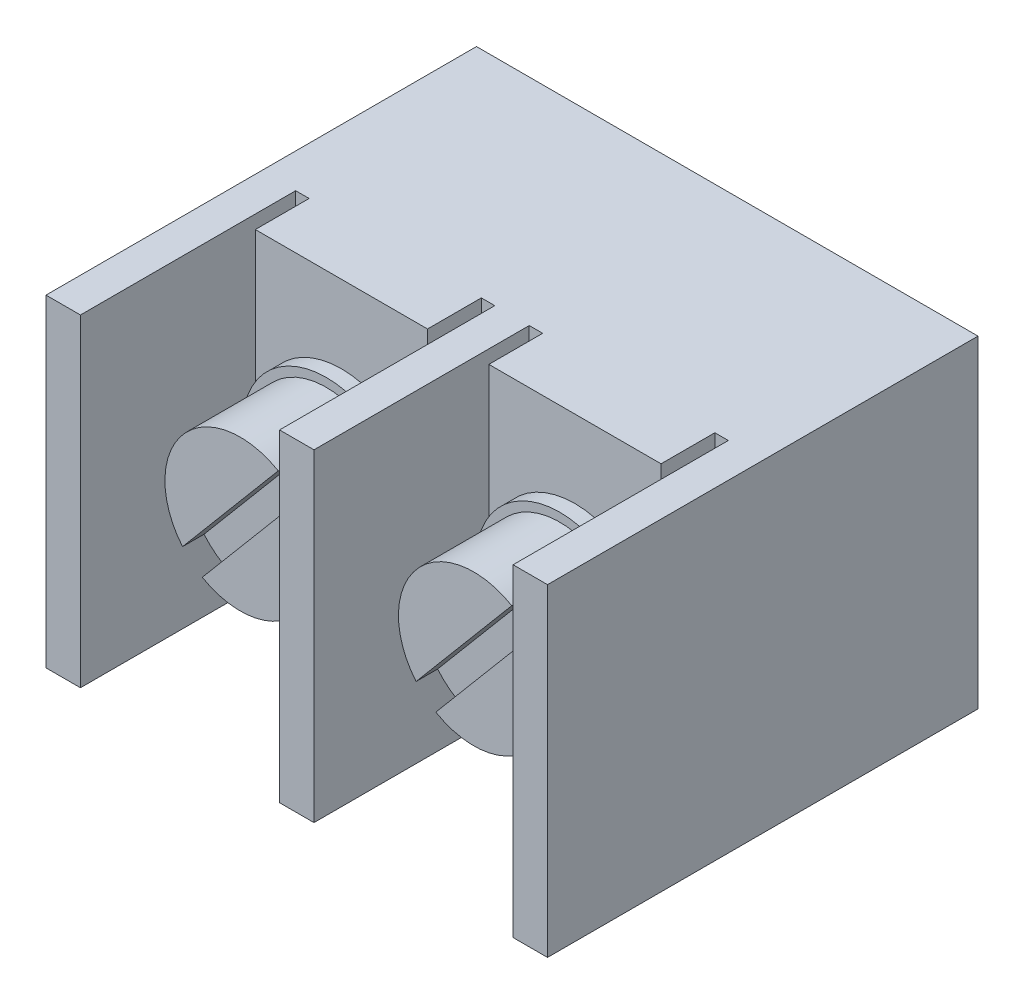
ISO-10303-21;
HEADER;
FILE_DESCRIPTION(('STEP AP214'),'2;1');
FILE_NAME('part.step','',(''),(''),'','','');
FILE_SCHEMA(('AUTOMOTIVE_DESIGN { 1 0 10303 214 1 1 1 1 }'));
ENDSEC;
DATA;
#1=APPLICATION_CONTEXT('core data for automotive mechanical design processes');
#2=APPLICATION_PROTOCOL_DEFINITION('international standard','automotive_design',2000,#1);
#3=PRODUCT_CONTEXT('',#1,'mechanical');
#4=PRODUCT('Part','Part','',(#3));
#5=PRODUCT_RELATED_PRODUCT_CATEGORY('part','',(#4));
#6=PRODUCT_DEFINITION_FORMATION('','',#4);
#7=PRODUCT_DEFINITION_CONTEXT('part definition',#1,'design');
#8=PRODUCT_DEFINITION('design','',#6,#7);
#9=PRODUCT_DEFINITION_SHAPE('','',#8);
#10=(LENGTH_UNIT() NAMED_UNIT(*) SI_UNIT(.MILLI.,.METRE.));
#11=(NAMED_UNIT(*) PLANE_ANGLE_UNIT() SI_UNIT($,.RADIAN.));
#12=(NAMED_UNIT(*) SI_UNIT($,.STERADIAN.) SOLID_ANGLE_UNIT());
#13=UNCERTAINTY_MEASURE_WITH_UNIT(LENGTH_MEASURE(1.E-05),#10,'distance_accuracy_value','');
#14=(GEOMETRIC_REPRESENTATION_CONTEXT(3) GLOBAL_UNCERTAINTY_ASSIGNED_CONTEXT((#13)) GLOBAL_UNIT_ASSIGNED_CONTEXT((#10,
#11,#12)) REPRESENTATION_CONTEXT('',''));
#15=CARTESIAN_POINT('',(0.,0.,0.));
#16=DIRECTION('',(0.,0.,1.));
#17=DIRECTION('',(1.,0.,0.));
#18=AXIS2_PLACEMENT_3D('',#15,#16,#17);
#19=CARTESIAN_POINT('',(-22.5,7.5,0.));
#20=DIRECTION('',(0.,0.,-1.));
#21=DIRECTION('',(-1.,0.,0.));
#22=AXIS2_PLACEMENT_3D('',#19,#20,#21);
#23=PLANE('',#22);
#24=DIRECTION('',(0.,1.,0.));
#25=VECTOR('',#24,1.);
#26=CARTESIAN_POINT('',(0.799999999999999,7.50000000000001,0.));
#27=LINE('',#26,#25);
#28=CARTESIAN_POINT('',(0.800000000000002,-7.5,0.));
#29=VERTEX_POINT('',#28);
#30=CARTESIAN_POINT('',(0.799999999999992,7.5,0.));
#31=VERTEX_POINT('',#30);
#32=EDGE_CURVE('E220',#29,#31,#27,.T.);
#33=ORIENTED_EDGE('',*,*,#32,.F.);
#34=DIRECTION('',(1.,0.,0.));
#35=VECTOR('',#34,1.);
#36=CARTESIAN_POINT('',(-22.5,-7.5,0.));
#37=LINE('',#36,#35);
#38=CARTESIAN_POINT('',(-22.5,-7.5,0.));
#39=VERTEX_POINT('',#38);
#40=EDGE_CURVE('E230',#39,#29,#37,.T.);
#41=ORIENTED_EDGE('',*,*,#40,.F.);
#42=DIRECTION('',(0.,-1.,0.));
#43=VECTOR('',#42,1.);
#44=CARTESIAN_POINT('',(-22.5,-7.5,0.));
#45=LINE('',#44,#43);
#46=CARTESIAN_POINT('',(-22.5,7.5,0.));
#47=VERTEX_POINT('',#46);
#48=EDGE_CURVE('E239',#47,#39,#45,.T.);
#49=ORIENTED_EDGE('',*,*,#48,.F.);
#50=DIRECTION('',(-1.,0.,0.));
#51=VECTOR('',#50,1.);
#52=CARTESIAN_POINT('',(-22.5,7.5,0.));
#53=LINE('',#52,#51);
#54=EDGE_CURVE('E232',#31,#47,#53,.T.);
#55=ORIENTED_EDGE('',*,*,#54,.F.);
#56=EDGE_LOOP('',(#33,#41,#49,#55));
#57=FACE_BOUND('',#56,.T.);
#58=CARTESIAN_POINT('',(-15.,0.,0.));
#59=DIRECTION('',(0.,0.,-1.));
#60=DIRECTION('',(-1.,0.,0.));
#61=AXIS2_PLACEMENT_3D('',#58,#59,#60);
#62=CIRCLE('',#61,0.849999999999998);
#63=CARTESIAN_POINT('',(-15.85,0.,0.));
#64=VERTEX_POINT('',#63);
#65=EDGE_CURVE('E233',#64,#64,#62,.T.);
#66=ORIENTED_EDGE('',*,*,#65,.F.);
#67=EDGE_LOOP('',(#66));
#68=FACE_BOUND('',#67,.T.);
#69=CARTESIAN_POINT('',(-5.,0.,0.));
#70=DIRECTION('',(0.,0.,-1.));
#71=DIRECTION('',(-1.,0.,0.));
#72=AXIS2_PLACEMENT_3D('',#69,#70,#71);
#73=CIRCLE('',#72,0.85);
#74=CARTESIAN_POINT('',(-5.85,0.,0.));
#75=VERTEX_POINT('',#74);
#76=EDGE_CURVE('E512',#75,#75,#73,.T.);
#77=ORIENTED_EDGE('',*,*,#76,.F.);
#78=EDGE_LOOP('',(#77));
#79=FACE_BOUND('',#78,.T.);
#80=ADVANCED_FACE('F31',(#57,#68,#79),#23,.T.);
#81=CARTESIAN_POINT('',(-5.425,0.,17.2));
#82=DIRECTION('',(0.,0.,1.));
#83=DIRECTION('',(1.,0.,0.));
#84=AXIS2_PLACEMENT_3D('',#81,#82,#83);
#85=PLANE('',#84);
#86=DIRECTION('',(-0.644608233576688,-0.764513064116724,0.));
#87=VECTOR('',#86,1.);
#88=CARTESIAN_POINT('',(-3.66097750792814,3.02294966009436,17.2));
#89=LINE('',#88,#87);
#90=CARTESIAN_POINT('',(-3.66097750792814,3.02294966009436,17.2));
#91=VERTEX_POINT('',#90);
#92=CARTESIAN_POINT('',(-8.10643816901193,-2.24941977980233,17.2));
#93=VERTEX_POINT('',#92);
#94=EDGE_CURVE('E497',#91,#93,#89,.T.);
#95=ORIENTED_EDGE('',*,*,#94,.F.);
#96=CARTESIAN_POINT('',(-5.425,0.,17.2));
#97=DIRECTION('',(0.,0.,1.));
#98=DIRECTION('',(1.,0.,0.));
#99=AXIS2_PLACEMENT_3D('',#96,#97,#98);
#100=CIRCLE('',#99,3.5);
#101=EDGE_CURVE('E453',#91,#93,#100,.T.);
#102=ORIENTED_EDGE('',*,*,#101,.T.);
#103=EDGE_LOOP('',(#95,#102));
#104=FACE_BOUND('',#103,.T.);
#105=ADVANCED_FACE('F303',(#104),#85,.T.);
#106=CARTESIAN_POINT('',(-16.275,0.,17.2));
#107=DIRECTION('',(0.,0.,1.));
#108=DIRECTION('',(1.,0.,0.));
#109=AXIS2_PLACEMENT_3D('',#106,#107,#108);
#110=PLANE('',#109);
#111=DIRECTION('',(-0.644608233576688,-0.764513064116724,0.));
#112=VECTOR('',#111,1.);
#113=CARTESIAN_POINT('',(-14.5109775079281,3.02294966009436,17.2));
#114=LINE('',#113,#112);
#115=CARTESIAN_POINT('',(-14.5109775079281,3.02294966009436,17.2));
#116=VERTEX_POINT('',#115);
#117=CARTESIAN_POINT('',(-18.9564381690119,-2.24941977980233,17.2));
#118=VERTEX_POINT('',#117);
#119=EDGE_CURVE('E473',#116,#118,#114,.T.);
#120=ORIENTED_EDGE('',*,*,#119,.F.);
#121=CARTESIAN_POINT('',(-16.275,0.,17.2));
#122=DIRECTION('',(0.,0.,1.));
#123=DIRECTION('',(1.,0.,0.));
#124=AXIS2_PLACEMENT_3D('',#121,#122,#123);
#125=CIRCLE('',#124,3.5);
#126=EDGE_CURVE('E448',#116,#118,#125,.T.);
#127=ORIENTED_EDGE('',*,*,#126,.T.);
#128=EDGE_LOOP('',(#120,#127));
#129=FACE_BOUND('',#128,.T.);
#130=ADVANCED_FACE('F308',(#129),#110,.T.);
#131=CARTESIAN_POINT('',(-5.425,0.,13.2));
#132=DIRECTION('',(0.,0.,1.));
#133=DIRECTION('',(1.,0.,0.));
#134=AXIS2_PLACEMENT_3D('',#131,#132,#133);
#135=PLANE('',#134);
#136=CARTESIAN_POINT('',(-5.425,0.,13.2));
#137=DIRECTION('',(0.,0.,1.));
#138=DIRECTION('',(1.,0.,0.));
#139=AXIS2_PLACEMENT_3D('',#136,#137,#138);
#140=CIRCLE('',#139,3.9);
#141=CARTESIAN_POINT('',(-1.525,0.,13.2));
#142=VERTEX_POINT('',#141);
#143=EDGE_CURVE('E445',#142,#142,#140,.T.);
#144=ORIENTED_EDGE('',*,*,#143,.T.);
#145=EDGE_LOOP('',(#144));
#146=FACE_BOUND('',#145,.T.);
#147=CARTESIAN_POINT('',(-5.425,0.,13.2));
#148=DIRECTION('',(0.,0.,1.));
#149=DIRECTION('',(1.,0.,0.));
#150=AXIS2_PLACEMENT_3D('',#147,#148,#149);
#151=CIRCLE('',#150,3.5);
#152=CARTESIAN_POINT('',(-1.925,0.,13.2));
#153=VERTEX_POINT('',#152);
#154=EDGE_CURVE('E456',#153,#153,#151,.T.);
#155=ORIENTED_EDGE('',*,*,#154,.F.);
#156=EDGE_LOOP('',(#155));
#157=FACE_BOUND('',#156,.T.);
#158=ADVANCED_FACE('F583',(#146,#157),#135,.T.);
#159=CARTESIAN_POINT('',(-16.275,0.,13.2));
#160=DIRECTION('',(0.,0.,1.));
#161=DIRECTION('',(1.,0.,0.));
#162=AXIS2_PLACEMENT_3D('',#159,#160,#161);
#163=PLANE('',#162);
#164=CARTESIAN_POINT('',(-16.275,0.,13.2));
#165=DIRECTION('',(0.,0.,1.));
#166=DIRECTION('',(1.,0.,0.));
#167=AXIS2_PLACEMENT_3D('',#164,#165,#166);
#168=CIRCLE('',#167,3.9);
#169=CARTESIAN_POINT('',(-12.375,0.,13.2));
#170=VERTEX_POINT('',#169);
#171=EDGE_CURVE('E435',#170,#170,#168,.T.);
#172=ORIENTED_EDGE('',*,*,#171,.T.);
#173=EDGE_LOOP('',(#172));
#174=FACE_BOUND('',#173,.T.);
#175=CARTESIAN_POINT('',(-16.275,0.,13.2));
#176=DIRECTION('',(0.,0.,1.));
#177=DIRECTION('',(1.,0.,0.));
#178=AXIS2_PLACEMENT_3D('',#175,#176,#177);
#179=CIRCLE('',#178,3.5);
#180=CARTESIAN_POINT('',(-12.775,0.,13.2));
#181=VERTEX_POINT('',#180);
#182=EDGE_CURVE('E449',#181,#181,#179,.T.);
#183=ORIENTED_EDGE('',*,*,#182,.F.);
#184=EDGE_LOOP('',(#183));
#185=FACE_BOUND('',#184,.T.);
#186=ADVANCED_FACE('F296',(#174,#185),#163,.T.);
#187=CARTESIAN_POINT('',(-9.425,-7.5,12.5));
#188=DIRECTION('',(0.,0.,-1.));
#189=DIRECTION('',(-1.,0.,0.));
#190=AXIS2_PLACEMENT_3D('',#187,#188,#189);
#191=PLANE('',#190);
#192=DIRECTION('',(0.,-1.,0.));
#193=VECTOR('',#192,1.);
#194=CARTESIAN_POINT('',(-9.425,-7.5,12.5));
#195=LINE('',#194,#193);
#196=CARTESIAN_POINT('',(-9.425,7.5,12.5));
#197=VERTEX_POINT('',#196);
#198=CARTESIAN_POINT('',(-9.425,-7.5,12.5));
#199=VERTEX_POINT('',#198);
#200=EDGE_CURVE('E431',#197,#199,#195,.T.);
#201=ORIENTED_EDGE('',*,*,#200,.T.);
#202=DIRECTION('',(1.,0.,0.));
#203=VECTOR('',#202,1.);
#204=CARTESIAN_POINT('',(-9.425,-7.5,12.5));
#205=LINE('',#204,#203);
#206=CARTESIAN_POINT('',(-1.425,-7.49999999999999,12.5));
#207=VERTEX_POINT('',#206);
#208=EDGE_CURVE('E439',#199,#207,#205,.T.);
#209=ORIENTED_EDGE('',*,*,#208,.T.);
#210=DIRECTION('',(0.,1.,0.));
#211=VECTOR('',#210,1.);
#212=CARTESIAN_POINT('',(-1.425,-7.49999999999999,12.5));
#213=LINE('',#212,#211);
#214=CARTESIAN_POINT('',(-1.425,7.50000000000001,12.5));
#215=VERTEX_POINT('',#214);
#216=EDGE_CURVE('E437',#207,#215,#213,.T.);
#217=ORIENTED_EDGE('',*,*,#216,.T.);
#218=DIRECTION('',(-1.,0.,0.));
#219=VECTOR('',#218,1.);
#220=CARTESIAN_POINT('',(-9.425,7.5,12.5));
#221=LINE('',#220,#219);
#222=EDGE_CURVE('E427',#215,#197,#221,.T.);
#223=ORIENTED_EDGE('',*,*,#222,.T.);
#224=EDGE_LOOP('',(#201,#209,#217,#223));
#225=FACE_BOUND('',#224,.T.);
#226=CARTESIAN_POINT('',(-5.425,0.,12.5));
#227=DIRECTION('',(0.,0.,-1.));
#228=DIRECTION('',(-1.,0.,0.));
#229=AXIS2_PLACEMENT_3D('',#226,#227,#228);
#230=CIRCLE('',#229,3.9);
#231=CARTESIAN_POINT('',(-9.325,0.,12.5));
#232=VERTEX_POINT('',#231);
#233=EDGE_CURVE('E11',#232,#232,#230,.F.);
#234=ORIENTED_EDGE('',*,*,#233,.F.);
#235=EDGE_LOOP('',(#234));
#236=FACE_BOUND('',#235,.T.);
#237=ADVANCED_FACE('F285',(#225,#236),#191,.F.);
#238=CARTESIAN_POINT('',(-20.275,-7.5,12.5));
#239=DIRECTION('',(0.,0.,-1.));
#240=DIRECTION('',(-1.,0.,0.));
#241=AXIS2_PLACEMENT_3D('',#238,#239,#240);
#242=PLANE('',#241);
#243=DIRECTION('',(0.,-1.,0.));
#244=VECTOR('',#243,1.);
#245=CARTESIAN_POINT('',(-20.275,-7.5,12.5));
#246=LINE('',#245,#244);
#247=CARTESIAN_POINT('',(-20.275,7.5,12.5));
#248=VERTEX_POINT('',#247);
#249=CARTESIAN_POINT('',(-20.275,-7.5,12.5));
#250=VERTEX_POINT('',#249);
#251=EDGE_CURVE('E405',#248,#250,#246,.T.);
#252=ORIENTED_EDGE('',*,*,#251,.T.);
#253=DIRECTION('',(1.,0.,0.));
#254=VECTOR('',#253,1.);
#255=CARTESIAN_POINT('',(-20.275,-7.5,12.5));
#256=LINE('',#255,#254);
#257=CARTESIAN_POINT('',(-12.275,-7.49999999999999,12.5));
#258=VERTEX_POINT('',#257);
#259=EDGE_CURVE('E413',#250,#258,#256,.T.);
#260=ORIENTED_EDGE('',*,*,#259,.T.);
#261=DIRECTION('',(0.,1.,0.));
#262=VECTOR('',#261,1.);
#263=CARTESIAN_POINT('',(-12.275,-7.49999999999999,12.5));
#264=LINE('',#263,#262);
#265=CARTESIAN_POINT('',(-12.275,7.50000000000001,12.5));
#266=VERTEX_POINT('',#265);
#267=EDGE_CURVE('E411',#258,#266,#264,.T.);
#268=ORIENTED_EDGE('',*,*,#267,.T.);
#269=DIRECTION('',(-1.,0.,0.));
#270=VECTOR('',#269,1.);
#271=CARTESIAN_POINT('',(-20.275,7.5,12.5));
#272=LINE('',#271,#270);
#273=EDGE_CURVE('E401',#266,#248,#272,.T.);
#274=ORIENTED_EDGE('',*,*,#273,.T.);
#275=EDGE_LOOP('',(#252,#260,#268,#274));
#276=FACE_BOUND('',#275,.T.);
#277=CARTESIAN_POINT('',(-16.275,0.,12.5));
#278=DIRECTION('',(0.,0.,-1.));
#279=DIRECTION('',(-1.,0.,0.));
#280=AXIS2_PLACEMENT_3D('',#277,#278,#279);
#281=CIRCLE('',#280,3.9);
#282=CARTESIAN_POINT('',(-20.175,0.,12.5));
#283=VERTEX_POINT('',#282);
#284=EDGE_CURVE('E39',#283,#283,#281,.F.);
#285=ORIENTED_EDGE('',*,*,#284,.F.);
#286=EDGE_LOOP('',(#285));
#287=FACE_BOUND('',#286,.T.);
#288=ADVANCED_FACE('F282',(#276,#287),#242,.F.);
#289=CARTESIAN_POINT('',(-22.5,7.5,10.));
#290=DIRECTION('',(0.,0.,-1.));
#291=DIRECTION('',(-1.,0.,0.));
#292=AXIS2_PLACEMENT_3D('',#289,#290,#291);
#293=PLANE('',#292);
#294=DIRECTION('',(0.,-1.,0.));
#295=VECTOR('',#294,1.);
#296=CARTESIAN_POINT('',(-9.425,-7.5,10.));
#297=LINE('',#296,#295);
#298=CARTESIAN_POINT('',(-9.425,7.5,10.));
#299=VERTEX_POINT('',#298);
#300=CARTESIAN_POINT('',(-9.42500000000001,-7.5,10.));
#301=VERTEX_POINT('',#300);
#302=EDGE_CURVE('E432',#299,#301,#297,.T.);
#303=ORIENTED_EDGE('',*,*,#302,.F.);
#304=DIRECTION('',(-1.,0.,0.));
#305=VECTOR('',#304,1.);
#306=CARTESIAN_POINT('',(-22.5,7.5,10.));
#307=LINE('',#306,#305);
#308=CARTESIAN_POINT('',(-10.05,7.5,10.));
#309=VERTEX_POINT('',#308);
#310=EDGE_CURVE('E275',#299,#309,#307,.T.);
#311=ORIENTED_EDGE('',*,*,#310,.T.);
#312=DIRECTION('',(0.,1.,0.));
#313=VECTOR('',#312,1.);
#314=CARTESIAN_POINT('',(-10.05,-7.5,10.));
#315=LINE('',#314,#313);
#316=CARTESIAN_POINT('',(-10.05,-7.5,10.));
#317=VERTEX_POINT('',#316);
#318=EDGE_CURVE('E358',#317,#309,#315,.T.);
#319=ORIENTED_EDGE('',*,*,#318,.F.);
#320=DIRECTION('',(1.,0.,0.));
#321=VECTOR('',#320,1.);
#322=CARTESIAN_POINT('',(-22.5,-7.5,10.));
#323=LINE('',#322,#321);
#324=EDGE_CURVE('E269',#317,#301,#323,.T.);
#325=ORIENTED_EDGE('',*,*,#324,.T.);
#326=EDGE_LOOP('',(#303,#311,#319,#325));
#327=FACE_BOUND('',#326,.T.);
#328=ADVANCED_FACE('F284',(#327),#293,.F.);
#329=DIRECTION('',(0.,1.,0.));
#330=VECTOR('',#329,1.);
#331=CARTESIAN_POINT('',(-1.425,-7.49999999999999,10.));
#332=LINE('',#331,#330);
#333=CARTESIAN_POINT('',(-1.425,-7.5,10.));
#334=VERTEX_POINT('',#333);
#335=CARTESIAN_POINT('',(-1.425,7.5,10.));
#336=VERTEX_POINT('',#335);
#337=EDGE_CURVE('E428',#334,#336,#332,.T.);
#338=ORIENTED_EDGE('',*,*,#337,.F.);
#339=CARTESIAN_POINT('',(-0.800000000000006,-7.5,10.));
#340=VERTEX_POINT('',#339);
#341=EDGE_CURVE('E241',#334,#340,#323,.T.);
#342=ORIENTED_EDGE('',*,*,#341,.T.);
#343=DIRECTION('',(0.,-1.,0.));
#344=VECTOR('',#343,1.);
#345=CARTESIAN_POINT('',(-0.799999999999999,-7.5,10.));
#346=LINE('',#345,#344);
#347=CARTESIAN_POINT('',(-0.8,7.5,10.));
#348=VERTEX_POINT('',#347);
#349=EDGE_CURVE('E379',#348,#340,#346,.T.);
#350=ORIENTED_EDGE('',*,*,#349,.F.);
#351=EDGE_CURVE('E250',#348,#336,#307,.T.);
#352=ORIENTED_EDGE('',*,*,#351,.T.);
#353=EDGE_LOOP('',(#338,#342,#350,#352));
#354=FACE_BOUND('',#353,.T.);
#355=ADVANCED_FACE('F292',(#354),#293,.F.);
#356=DIRECTION('',(0.,-1.,0.));
#357=VECTOR('',#356,1.);
#358=CARTESIAN_POINT('',(-20.275,-7.5,10.));
#359=LINE('',#358,#357);
#360=CARTESIAN_POINT('',(-20.275,7.5,10.));
#361=VERTEX_POINT('',#360);
#362=CARTESIAN_POINT('',(-20.275,-7.5,10.));
#363=VERTEX_POINT('',#362);
#364=EDGE_CURVE('E406',#361,#363,#359,.T.);
#365=ORIENTED_EDGE('',*,*,#364,.F.);
#366=CARTESIAN_POINT('',(-20.9,7.5,10.));
#367=VERTEX_POINT('',#366);
#368=EDGE_CURVE('E255',#361,#367,#307,.T.);
#369=ORIENTED_EDGE('',*,*,#368,.T.);
#370=DIRECTION('',(0.,1.,0.));
#371=VECTOR('',#370,1.);
#372=CARTESIAN_POINT('',(-20.9,-7.5,10.));
#373=LINE('',#372,#371);
#374=CARTESIAN_POINT('',(-20.9,-7.5,10.));
#375=VERTEX_POINT('',#374);
#376=EDGE_CURVE('E257',#375,#367,#373,.T.);
#377=ORIENTED_EDGE('',*,*,#376,.F.);
#378=EDGE_CURVE('E252',#375,#363,#323,.T.);
#379=ORIENTED_EDGE('',*,*,#378,.T.);
#380=EDGE_LOOP('',(#365,#369,#377,#379));
#381=FACE_BOUND('',#380,.T.);
#382=ADVANCED_FACE('F295',(#381),#293,.F.);
#383=DIRECTION('',(0.,1.,0.));
#384=VECTOR('',#383,1.);
#385=CARTESIAN_POINT('',(-12.275,-7.49999999999999,10.));
#386=LINE('',#385,#384);
#387=CARTESIAN_POINT('',(-12.275,-7.5,10.));
#388=VERTEX_POINT('',#387);
#389=CARTESIAN_POINT('',(-12.275,7.5,10.));
#390=VERTEX_POINT('',#389);
#391=EDGE_CURVE('E402',#388,#390,#386,.T.);
#392=ORIENTED_EDGE('',*,*,#391,.F.);
#393=CARTESIAN_POINT('',(-11.65,-7.5,10.));
#394=VERTEX_POINT('',#393);
#395=EDGE_CURVE('E256',#388,#394,#323,.T.);
#396=ORIENTED_EDGE('',*,*,#395,.T.);
#397=DIRECTION('',(0.,-1.,0.));
#398=VECTOR('',#397,1.);
#399=CARTESIAN_POINT('',(-11.65,-7.5,10.));
#400=LINE('',#399,#398);
#401=CARTESIAN_POINT('',(-11.65,7.5,10.));
#402=VERTEX_POINT('',#401);
#403=EDGE_CURVE('E362',#402,#394,#400,.T.);
#404=ORIENTED_EDGE('',*,*,#403,.F.);
#405=EDGE_CURVE('E276',#402,#390,#307,.T.);
#406=ORIENTED_EDGE('',*,*,#405,.T.);
#407=EDGE_LOOP('',(#392,#396,#404,#406));
#408=FACE_BOUND('',#407,.T.);
#409=ADVANCED_FACE('F321',(#408),#293,.F.);
#410=CARTESIAN_POINT('',(-22.5,-7.5,10.));
#411=DIRECTION('',(1.,0.,0.));
#412=DIRECTION('',(0.,0.,-1.));
#413=AXIS2_PLACEMENT_3D('',#410,#411,#412);
#414=PLANE('',#413);
#415=ORIENTED_EDGE('',*,*,#48,.T.);
#416=DIRECTION('',(0.,0.,-1.));
#417=VECTOR('',#416,1.);
#418=CARTESIAN_POINT('',(-22.5,-7.5,10.));
#419=LINE('',#418,#417);
#420=CARTESIAN_POINT('',(-22.5,-7.5,20.));
#421=VERTEX_POINT('',#420);
#422=EDGE_CURVE('E237',#421,#39,#419,.T.);
#423=ORIENTED_EDGE('',*,*,#422,.F.);
#424=DIRECTION('',(0.,-1.,0.));
#425=VECTOR('',#424,1.);
#426=CARTESIAN_POINT('',(-22.5,-7.5,20.));
#427=LINE('',#426,#425);
#428=CARTESIAN_POINT('',(-22.5,7.5,20.));
#429=VERTEX_POINT('',#428);
#430=EDGE_CURVE('E329',#429,#421,#427,.T.);
#431=ORIENTED_EDGE('',*,*,#430,.F.);
#432=DIRECTION('',(0.,0.,-1.));
#433=VECTOR('',#432,1.);
#434=CARTESIAN_POINT('',(-22.5,7.5,10.));
#435=LINE('',#434,#433);
#436=EDGE_CURVE('E247',#429,#47,#435,.T.);
#437=ORIENTED_EDGE('',*,*,#436,.T.);
#438=EDGE_LOOP('',(#415,#423,#431,#437));
#439=FACE_BOUND('',#438,.T.);
#440=ADVANCED_FACE('F33',(#439),#414,.F.);
#441=CARTESIAN_POINT('',(-22.5,-7.5,10.));
#442=DIRECTION('',(0.,1.,0.));
#443=DIRECTION('',(0.,0.,1.));
#444=AXIS2_PLACEMENT_3D('',#441,#442,#443);
#445=PLANE('',#444);
#446=ORIENTED_EDGE('',*,*,#40,.T.);
#447=DIRECTION('',(0.,0.,-1.));
#448=VECTOR('',#447,1.);
#449=CARTESIAN_POINT('',(0.800000000000004,-7.5,20.));
#450=LINE('',#449,#448);
#451=CARTESIAN_POINT('',(0.800000000000004,-7.5,20.));
#452=VERTEX_POINT('',#451);
#453=EDGE_CURVE('E217',#452,#29,#450,.T.);
#454=ORIENTED_EDGE('',*,*,#453,.F.);
#455=DIRECTION('',(1.,0.,0.));
#456=VECTOR('',#455,1.);
#457=CARTESIAN_POINT('',(-0.799999999999999,-7.5,20.));
#458=LINE('',#457,#456);
#459=CARTESIAN_POINT('',(-0.799999999999999,-7.5,20.));
#460=VERTEX_POINT('',#459);
#461=EDGE_CURVE('E386',#460,#452,#458,.T.);
#462=ORIENTED_EDGE('',*,*,#461,.F.);
#463=DIRECTION('',(0.,0.,-1.));
#464=VECTOR('',#463,1.);
#465=CARTESIAN_POINT('',(-0.799999999999999,-7.5,20.));
#466=LINE('',#465,#464);
#467=EDGE_CURVE('E225',#460,#340,#466,.T.);
#468=ORIENTED_EDGE('',*,*,#467,.T.);
#469=ORIENTED_EDGE('',*,*,#341,.F.);
#470=DIRECTION('',(0.,0.,-1.));
#471=VECTOR('',#470,1.);
#472=CARTESIAN_POINT('',(-1.425,-7.49999999999999,12.5));
#473=LINE('',#472,#471);
#474=EDGE_CURVE('E418',#207,#334,#473,.T.);
#475=ORIENTED_EDGE('',*,*,#474,.F.);
#476=ORIENTED_EDGE('',*,*,#208,.F.);
#477=DIRECTION('',(0.,0.,-1.));
#478=VECTOR('',#477,1.);
#479=CARTESIAN_POINT('',(-9.425,-7.5,12.5));
#480=LINE('',#479,#478);
#481=EDGE_CURVE('E409',#199,#301,#480,.T.);
#482=ORIENTED_EDGE('',*,*,#481,.T.);
#483=ORIENTED_EDGE('',*,*,#324,.F.);
#484=DIRECTION('',(0.,0.,-1.));
#485=VECTOR('',#484,1.);
#486=CARTESIAN_POINT('',(-10.05,-7.5,20.));
#487=LINE('',#486,#485);
#488=CARTESIAN_POINT('',(-10.05,-7.5,20.));
#489=VERTEX_POINT('',#488);
#490=EDGE_CURVE('E348',#489,#317,#487,.T.);
#491=ORIENTED_EDGE('',*,*,#490,.F.);
#492=DIRECTION('',(1.,0.,0.));
#493=VECTOR('',#492,1.);
#494=CARTESIAN_POINT('',(-11.65,-7.5,20.));
#495=LINE('',#494,#493);
#496=CARTESIAN_POINT('',(-11.65,-7.5,20.));
#497=VERTEX_POINT('',#496);
#498=EDGE_CURVE('E368',#497,#489,#495,.T.);
#499=ORIENTED_EDGE('',*,*,#498,.F.);
#500=DIRECTION('',(0.,0.,-1.));
#501=VECTOR('',#500,1.);
#502=CARTESIAN_POINT('',(-11.65,-7.5,20.));
#503=LINE('',#502,#501);
#504=EDGE_CURVE('E345',#497,#394,#503,.T.);
#505=ORIENTED_EDGE('',*,*,#504,.T.);
#506=ORIENTED_EDGE('',*,*,#395,.F.);
#507=DIRECTION('',(0.,0.,-1.));
#508=VECTOR('',#507,1.);
#509=CARTESIAN_POINT('',(-12.275,-7.49999999999999,12.5));
#510=LINE('',#509,#508);
#511=EDGE_CURVE('E392',#258,#388,#510,.T.);
#512=ORIENTED_EDGE('',*,*,#511,.F.);
#513=ORIENTED_EDGE('',*,*,#259,.F.);
#514=DIRECTION('',(0.,0.,-1.));
#515=VECTOR('',#514,1.);
#516=CARTESIAN_POINT('',(-20.275,-7.5,12.5));
#517=LINE('',#516,#515);
#518=EDGE_CURVE('E383',#250,#363,#517,.T.);
#519=ORIENTED_EDGE('',*,*,#518,.T.);
#520=ORIENTED_EDGE('',*,*,#378,.F.);
#521=DIRECTION('',(0.,0.,-1.));
#522=VECTOR('',#521,1.);
#523=CARTESIAN_POINT('',(-20.9,-7.5,20.));
#524=LINE('',#523,#522);
#525=CARTESIAN_POINT('',(-20.9,-7.5,20.));
#526=VERTEX_POINT('',#525);
#527=EDGE_CURVE('E243',#526,#375,#524,.T.);
#528=ORIENTED_EDGE('',*,*,#527,.F.);
#529=DIRECTION('',(1.,0.,0.));
#530=VECTOR('',#529,1.);
#531=CARTESIAN_POINT('',(-22.5,-7.5,20.));
#532=LINE('',#531,#530);
#533=EDGE_CURVE('E340',#421,#526,#532,.T.);
#534=ORIENTED_EDGE('',*,*,#533,.F.);
#535=ORIENTED_EDGE('',*,*,#422,.T.);
#536=EDGE_LOOP('',(#446,#454,#462,#468,#469,#475,#476,#482,#483,#491,#499,#505,#506,#512,#513,
#519,#520,#528,#534,#535));
#537=FACE_BOUND('',#536,.T.);
#538=ADVANCED_FACE('F235',(#537),#445,.F.);
#539=CARTESIAN_POINT('',(-22.5,7.5,10.));
#540=DIRECTION('',(0.,-1.,0.));
#541=DIRECTION('',(0.,0.,-1.));
#542=AXIS2_PLACEMENT_3D('',#539,#540,#541);
#543=PLANE('',#542);
#544=DIRECTION('',(0.,0.,-1.));
#545=VECTOR('',#544,1.);
#546=CARTESIAN_POINT('',(0.800000000000001,7.5,20.));
#547=LINE('',#546,#545);
#548=CARTESIAN_POINT('',(0.800000000000001,7.5,20.));
#549=VERTEX_POINT('',#548);
#550=EDGE_CURVE('E46',#549,#31,#547,.T.);
#551=ORIENTED_EDGE('',*,*,#550,.T.);
#552=ORIENTED_EDGE('',*,*,#54,.T.);
#553=ORIENTED_EDGE('',*,*,#436,.F.);
#554=DIRECTION('',(-1.,0.,0.));
#555=VECTOR('',#554,1.);
#556=CARTESIAN_POINT('',(-22.5,7.5,20.));
#557=LINE('',#556,#555);
#558=CARTESIAN_POINT('',(-20.9,7.5,20.));
#559=VERTEX_POINT('',#558);
#560=EDGE_CURVE('E333',#559,#429,#557,.T.);
#561=ORIENTED_EDGE('',*,*,#560,.F.);
#562=DIRECTION('',(0.,0.,-1.));
#563=VECTOR('',#562,1.);
#564=CARTESIAN_POINT('',(-20.9,7.5,20.));
#565=LINE('',#564,#563);
#566=EDGE_CURVE('E339',#559,#367,#565,.T.);
#567=ORIENTED_EDGE('',*,*,#566,.T.);
#568=ORIENTED_EDGE('',*,*,#368,.F.);
#569=DIRECTION('',(0.,0.,-1.));
#570=VECTOR('',#569,1.);
#571=CARTESIAN_POINT('',(-20.275,7.5,12.5));
#572=LINE('',#571,#570);
#573=EDGE_CURVE('E398',#248,#361,#572,.T.);
#574=ORIENTED_EDGE('',*,*,#573,.F.);
#575=ORIENTED_EDGE('',*,*,#273,.F.);
#576=DIRECTION('',(0.,0.,-1.));
#577=VECTOR('',#576,1.);
#578=CARTESIAN_POINT('',(-12.275,7.50000000000001,12.5));
#579=LINE('',#578,#577);
#580=EDGE_CURVE('E395',#266,#390,#579,.T.);
#581=ORIENTED_EDGE('',*,*,#580,.T.);
#582=ORIENTED_EDGE('',*,*,#405,.F.);
#583=DIRECTION('',(0.,0.,-1.));
#584=VECTOR('',#583,1.);
#585=CARTESIAN_POINT('',(-11.65,7.5,20.));
#586=LINE('',#585,#584);
#587=CARTESIAN_POINT('',(-11.65,7.5,20.));
#588=VERTEX_POINT('',#587);
#589=EDGE_CURVE('E354',#588,#402,#586,.T.);
#590=ORIENTED_EDGE('',*,*,#589,.F.);
#591=DIRECTION('',(-1.,0.,0.));
#592=VECTOR('',#591,1.);
#593=CARTESIAN_POINT('',(-11.65,7.5,20.));
#594=LINE('',#593,#592);
#595=CARTESIAN_POINT('',(-10.05,7.5,20.));
#596=VERTEX_POINT('',#595);
#597=EDGE_CURVE('E357',#596,#588,#594,.T.);
#598=ORIENTED_EDGE('',*,*,#597,.F.);
#599=DIRECTION('',(0.,0.,-1.));
#600=VECTOR('',#599,1.);
#601=CARTESIAN_POINT('',(-10.05,7.5,20.));
#602=LINE('',#601,#600);
#603=EDGE_CURVE('E351',#596,#309,#602,.T.);
#604=ORIENTED_EDGE('',*,*,#603,.T.);
#605=ORIENTED_EDGE('',*,*,#310,.F.);
#606=DIRECTION('',(0.,0.,-1.));
#607=VECTOR('',#606,1.);
#608=CARTESIAN_POINT('',(-9.425,7.5,12.5));
#609=LINE('',#608,#607);
#610=EDGE_CURVE('E424',#197,#299,#609,.T.);
#611=ORIENTED_EDGE('',*,*,#610,.F.);
#612=ORIENTED_EDGE('',*,*,#222,.F.);
#613=DIRECTION('',(0.,0.,-1.));
#614=VECTOR('',#613,1.);
#615=CARTESIAN_POINT('',(-1.425,7.50000000000001,12.5));
#616=LINE('',#615,#614);
#617=EDGE_CURVE('E421',#215,#336,#616,.T.);
#618=ORIENTED_EDGE('',*,*,#617,.T.);
#619=ORIENTED_EDGE('',*,*,#351,.F.);
#620=DIRECTION('',(0.,0.,-1.));
#621=VECTOR('',#620,1.);
#622=CARTESIAN_POINT('',(-0.8,7.5,20.));
#623=LINE('',#622,#621);
#624=CARTESIAN_POINT('',(-0.8,7.5,20.));
#625=VERTEX_POINT('',#624);
#626=EDGE_CURVE('E375',#625,#348,#623,.T.);
#627=ORIENTED_EDGE('',*,*,#626,.F.);
#628=DIRECTION('',(-1.,0.,0.));
#629=VECTOR('',#628,1.);
#630=CARTESIAN_POINT('',(-0.8,7.5,20.));
#631=LINE('',#630,#629);
#632=EDGE_CURVE('E378',#549,#625,#631,.T.);
#633=ORIENTED_EDGE('',*,*,#632,.F.);
#634=EDGE_LOOP('',(#551,#552,#553,#561,#567,#568,#574,#575,#581,#582,#590,#598,#604,#605,#611,
#612,#618,#619,#627,#633));
#635=FACE_BOUND('',#634,.T.);
#636=ADVANCED_FACE('F314',(#635),#543,.F.);
#637=CARTESIAN_POINT('',(-20.9,-7.5,20.));
#638=DIRECTION('',(-1.,0.,0.));
#639=DIRECTION('',(0.,0.,1.));
#640=AXIS2_PLACEMENT_3D('',#637,#638,#639);
#641=PLANE('',#640);
#642=ORIENTED_EDGE('',*,*,#376,.T.);
#643=ORIENTED_EDGE('',*,*,#566,.F.);
#644=DIRECTION('',(0.,1.,0.));
#645=VECTOR('',#644,1.);
#646=CARTESIAN_POINT('',(-20.9,-7.5,20.));
#647=LINE('',#646,#645);
#648=EDGE_CURVE('E337',#526,#559,#647,.T.);
#649=ORIENTED_EDGE('',*,*,#648,.F.);
#650=ORIENTED_EDGE('',*,*,#527,.T.);
#651=EDGE_LOOP('',(#642,#643,#649,#650));
#652=FACE_BOUND('',#651,.T.);
#653=ADVANCED_FACE('F316',(#652),#641,.F.);
#654=CARTESIAN_POINT('',(-22.5,7.5,20.));
#655=DIRECTION('',(0.,0.,-1.));
#656=DIRECTION('',(-1.,0.,0.));
#657=AXIS2_PLACEMENT_3D('',#654,#655,#656);
#658=PLANE('',#657);
#659=ORIENTED_EDGE('',*,*,#430,.T.);
#660=ORIENTED_EDGE('',*,*,#533,.T.);
#661=ORIENTED_EDGE('',*,*,#648,.T.);
#662=ORIENTED_EDGE('',*,*,#560,.T.);
#663=EDGE_LOOP('',(#659,#660,#661,#662));
#664=FACE_BOUND('',#663,.T.);
#665=ADVANCED_FACE('F335',(#664),#658,.F.);
#666=CARTESIAN_POINT('',(-11.65,-7.5,20.));
#667=DIRECTION('',(1.,0.,0.));
#668=DIRECTION('',(0.,0.,-1.));
#669=AXIS2_PLACEMENT_3D('',#666,#667,#668);
#670=PLANE('',#669);
#671=ORIENTED_EDGE('',*,*,#403,.T.);
#672=ORIENTED_EDGE('',*,*,#504,.F.);
#673=DIRECTION('',(0.,-1.,0.));
#674=VECTOR('',#673,1.);
#675=CARTESIAN_POINT('',(-11.65,-7.5,20.));
#676=LINE('',#675,#674);
#677=EDGE_CURVE('E361',#588,#497,#676,.T.);
#678=ORIENTED_EDGE('',*,*,#677,.F.);
#679=ORIENTED_EDGE('',*,*,#589,.T.);
#680=EDGE_LOOP('',(#671,#672,#678,#679));
#681=FACE_BOUND('',#680,.T.);
#682=ADVANCED_FACE('F632',(#681),#670,.F.);
#683=CARTESIAN_POINT('',(-10.05,-7.5,20.));
#684=DIRECTION('',(-1.,0.,0.));
#685=DIRECTION('',(0.,-1.,0.));
#686=AXIS2_PLACEMENT_3D('',#683,#684,#685);
#687=PLANE('',#686);
#688=ORIENTED_EDGE('',*,*,#318,.T.);
#689=ORIENTED_EDGE('',*,*,#603,.F.);
#690=DIRECTION('',(0.,1.,0.));
#691=VECTOR('',#690,1.);
#692=CARTESIAN_POINT('',(-10.05,-7.5,20.));
#693=LINE('',#692,#691);
#694=EDGE_CURVE('E366',#489,#596,#693,.T.);
#695=ORIENTED_EDGE('',*,*,#694,.F.);
#696=ORIENTED_EDGE('',*,*,#490,.T.);
#697=EDGE_LOOP('',(#688,#689,#695,#696));
#698=FACE_BOUND('',#697,.T.);
#699=ADVANCED_FACE('F625',(#698),#687,.F.);
#700=CARTESIAN_POINT('',(-11.65,7.5,20.));
#701=DIRECTION('',(0.,0.,-1.));
#702=DIRECTION('',(-1.,0.,0.));
#703=AXIS2_PLACEMENT_3D('',#700,#701,#702);
#704=PLANE('',#703);
#705=ORIENTED_EDGE('',*,*,#677,.T.);
#706=ORIENTED_EDGE('',*,*,#498,.T.);
#707=ORIENTED_EDGE('',*,*,#694,.T.);
#708=ORIENTED_EDGE('',*,*,#597,.T.);
#709=EDGE_LOOP('',(#705,#706,#707,#708));
#710=FACE_BOUND('',#709,.T.);
#711=ADVANCED_FACE('F630',(#710),#704,.F.);
#712=CARTESIAN_POINT('',(-0.799999999999999,-7.5,20.));
#713=DIRECTION('',(1.,0.,0.));
#714=DIRECTION('',(0.,1.,0.));
#715=AXIS2_PLACEMENT_3D('',#712,#713,#714);
#716=PLANE('',#715);
#717=ORIENTED_EDGE('',*,*,#349,.T.);
#718=ORIENTED_EDGE('',*,*,#467,.F.);
#719=DIRECTION('',(0.,-1.,0.));
#720=VECTOR('',#719,1.);
#721=CARTESIAN_POINT('',(-0.799999999999999,-7.5,20.));
#722=LINE('',#721,#720);
#723=EDGE_CURVE('E382',#625,#460,#722,.T.);
#724=ORIENTED_EDGE('',*,*,#723,.F.);
#725=ORIENTED_EDGE('',*,*,#626,.T.);
#726=EDGE_LOOP('',(#717,#718,#724,#725));
#727=FACE_BOUND('',#726,.T.);
#728=ADVANCED_FACE('F666',(#727),#716,.F.);
#729=CARTESIAN_POINT('',(0.800000000000004,-7.5,20.));
#730=DIRECTION('',(-1.,0.,0.));
#731=DIRECTION('',(0.,-1.,0.));
#732=AXIS2_PLACEMENT_3D('',#729,#730,#731);
#733=PLANE('',#732);
#734=ORIENTED_EDGE('',*,*,#453,.T.);
#735=ORIENTED_EDGE('',*,*,#32,.T.);
#736=ORIENTED_EDGE('',*,*,#550,.F.);
#737=DIRECTION('',(0.,1.,0.));
#738=VECTOR('',#737,1.);
#739=CARTESIAN_POINT('',(0.800000000000004,-7.5,20.));
#740=LINE('',#739,#738);
#741=EDGE_CURVE('E222',#452,#549,#740,.T.);
#742=ORIENTED_EDGE('',*,*,#741,.F.);
#743=EDGE_LOOP('',(#734,#735,#736,#742));
#744=FACE_BOUND('',#743,.T.);
#745=ADVANCED_FACE('F219',(#744),#733,.F.);
#746=CARTESIAN_POINT('',(-0.8,7.5,20.));
#747=DIRECTION('',(0.,0.,-1.));
#748=DIRECTION('',(-1.,0.,0.));
#749=AXIS2_PLACEMENT_3D('',#746,#747,#748);
#750=PLANE('',#749);
#751=ORIENTED_EDGE('',*,*,#723,.T.);
#752=ORIENTED_EDGE('',*,*,#461,.T.);
#753=ORIENTED_EDGE('',*,*,#741,.T.);
#754=ORIENTED_EDGE('',*,*,#632,.T.);
#755=EDGE_LOOP('',(#751,#752,#753,#754));
#756=FACE_BOUND('',#755,.T.);
#757=ADVANCED_FACE('F672',(#756),#750,.F.);
#758=CARTESIAN_POINT('',(-20.275,-7.5,12.5));
#759=DIRECTION('',(1.,0.,0.));
#760=DIRECTION('',(0.,0.,-1.));
#761=AXIS2_PLACEMENT_3D('',#758,#759,#760);
#762=PLANE('',#761);
#763=ORIENTED_EDGE('',*,*,#364,.T.);
#764=ORIENTED_EDGE('',*,*,#518,.F.);
#765=ORIENTED_EDGE('',*,*,#251,.F.);
#766=ORIENTED_EDGE('',*,*,#573,.T.);
#767=EDGE_LOOP('',(#763,#764,#765,#766));
#768=FACE_BOUND('',#767,.T.);
#769=ADVANCED_FACE('F606',(#768),#762,.F.);
#770=CARTESIAN_POINT('',(-12.275,-7.49999999999999,12.5));
#771=DIRECTION('',(-1.,0.,0.));
#772=DIRECTION('',(0.,-1.,0.));
#773=AXIS2_PLACEMENT_3D('',#770,#771,#772);
#774=PLANE('',#773);
#775=ORIENTED_EDGE('',*,*,#391,.T.);
#776=ORIENTED_EDGE('',*,*,#580,.F.);
#777=ORIENTED_EDGE('',*,*,#267,.F.);
#778=ORIENTED_EDGE('',*,*,#511,.T.);
#779=EDGE_LOOP('',(#775,#776,#777,#778));
#780=FACE_BOUND('',#779,.T.);
#781=ADVANCED_FACE('F601',(#780),#774,.F.);
#782=CARTESIAN_POINT('',(-9.425,-7.5,12.5));
#783=DIRECTION('',(1.,0.,0.));
#784=DIRECTION('',(0.,0.,-1.));
#785=AXIS2_PLACEMENT_3D('',#782,#783,#784);
#786=PLANE('',#785);
#787=ORIENTED_EDGE('',*,*,#302,.T.);
#788=ORIENTED_EDGE('',*,*,#481,.F.);
#789=ORIENTED_EDGE('',*,*,#200,.F.);
#790=ORIENTED_EDGE('',*,*,#610,.T.);
#791=EDGE_LOOP('',(#787,#788,#789,#790));
#792=FACE_BOUND('',#791,.T.);
#793=ADVANCED_FACE('F598',(#792),#786,.F.);
#794=CARTESIAN_POINT('',(-1.425,-7.49999999999999,12.5));
#795=DIRECTION('',(-1.,0.,0.));
#796=DIRECTION('',(0.,-1.,0.));
#797=AXIS2_PLACEMENT_3D('',#794,#795,#796);
#798=PLANE('',#797);
#799=ORIENTED_EDGE('',*,*,#337,.T.);
#800=ORIENTED_EDGE('',*,*,#617,.F.);
#801=ORIENTED_EDGE('',*,*,#216,.F.);
#802=ORIENTED_EDGE('',*,*,#474,.T.);
#803=EDGE_LOOP('',(#799,#800,#801,#802));
#804=FACE_BOUND('',#803,.T.);
#805=ADVANCED_FACE('F594',(#804),#798,.F.);
#806=CARTESIAN_POINT('',(-16.275,0.,13.2));
#807=DIRECTION('',(0.,0.,-1.));
#808=DIRECTION('',(-1.,0.,0.));
#809=AXIS2_PLACEMENT_3D('',#806,#807,#808);
#810=CYLINDRICAL_SURFACE('',#809,3.9);
#811=ORIENTED_EDGE('',*,*,#171,.F.);
#812=EDGE_LOOP('',(#811));
#813=FACE_BOUND('',#812,.T.);
#814=ORIENTED_EDGE('',*,*,#284,.T.);
#815=EDGE_LOOP('',(#814));
#816=FACE_BOUND('',#815,.T.);
#817=ADVANCED_FACE('F280',(#813,#816),#810,.T.);
#818=CARTESIAN_POINT('',(-5.425,0.,13.2));
#819=DIRECTION('',(0.,0.,-1.));
#820=DIRECTION('',(-1.,0.,0.));
#821=AXIS2_PLACEMENT_3D('',#818,#819,#820);
#822=CYLINDRICAL_SURFACE('',#821,3.9);
#823=ORIENTED_EDGE('',*,*,#143,.F.);
#824=EDGE_LOOP('',(#823));
#825=FACE_BOUND('',#824,.T.);
#826=ORIENTED_EDGE('',*,*,#233,.T.);
#827=EDGE_LOOP('',(#826));
#828=FACE_BOUND('',#827,.T.);
#829=ADVANCED_FACE('F581',(#825,#828),#822,.T.);
#830=CARTESIAN_POINT('',(-16.275,0.,17.2));
#831=DIRECTION('',(0.,0.,-1.));
#832=DIRECTION('',(-1.,0.,0.));
#833=AXIS2_PLACEMENT_3D('',#830,#831,#832);
#834=CYLINDRICAL_SURFACE('',#833,3.5);
#835=ORIENTED_EDGE('',*,*,#126,.F.);
#836=DIRECTION('',(0.,0.,1.));
#837=VECTOR('',#836,1.);
#838=CARTESIAN_POINT('',(-14.5109775079281,3.02294966009436,16.2));
#839=LINE('',#838,#837);
#840=CARTESIAN_POINT('',(-14.5109775079281,3.02294966009436,16.2));
#841=VERTEX_POINT('',#840);
#842=EDGE_CURVE('E469',#841,#116,#839,.T.);
#843=ORIENTED_EDGE('',*,*,#842,.F.);
#844=CARTESIAN_POINT('',(-16.275,0.,16.2));
#845=DIRECTION('',(0.,0.,1.));
#846=DIRECTION('',(1.,0.,0.));
#847=AXIS2_PLACEMENT_3D('',#844,#845,#846);
#848=CIRCLE('',#847,3.5);
#849=CARTESIAN_POINT('',(-13.5935618309881,2.24941977980233,16.2));
#850=VERTEX_POINT('',#849);
#851=EDGE_CURVE('E481',#850,#841,#848,.T.);
#852=ORIENTED_EDGE('',*,*,#851,.F.);
#853=DIRECTION('',(0.,0.,1.));
#854=VECTOR('',#853,1.);
#855=CARTESIAN_POINT('',(-13.5935618309881,2.24941977980233,16.2));
#856=LINE('',#855,#854);
#857=CARTESIAN_POINT('',(-13.5935618309881,2.24941977980233,17.2));
#858=VERTEX_POINT('',#857);
#859=EDGE_CURVE('E465',#850,#858,#856,.T.);
#860=ORIENTED_EDGE('',*,*,#859,.T.);
#861=CARTESIAN_POINT('',(-18.0390224920719,-3.02294966009436,17.2));
#862=VERTEX_POINT('',#861);
#863=EDGE_CURVE('E452',#862,#858,#125,.T.);
#864=ORIENTED_EDGE('',*,*,#863,.F.);
#865=DIRECTION('',(0.,0.,1.));
#866=VECTOR('',#865,1.);
#867=CARTESIAN_POINT('',(-18.0390224920719,-3.02294966009436,16.2));
#868=LINE('',#867,#866);
#869=CARTESIAN_POINT('',(-18.0390224920719,-3.02294966009436,16.2));
#870=VERTEX_POINT('',#869);
#871=EDGE_CURVE('E463',#870,#862,#868,.T.);
#872=ORIENTED_EDGE('',*,*,#871,.F.);
#873=CARTESIAN_POINT('',(-16.275,0.,16.2));
#874=DIRECTION('',(0.,0.,1.));
#875=DIRECTION('',(1.,0.,0.));
#876=AXIS2_PLACEMENT_3D('',#873,#874,#875);
#877=CIRCLE('',#876,3.5);
#878=CARTESIAN_POINT('',(-18.9564381690119,-2.24941977980233,16.2));
#879=VERTEX_POINT('',#878);
#880=EDGE_CURVE('E475',#879,#870,#877,.T.);
#881=ORIENTED_EDGE('',*,*,#880,.F.);
#882=DIRECTION('',(0.,0.,1.));
#883=VECTOR('',#882,1.);
#884=CARTESIAN_POINT('',(-18.9564381690119,-2.24941977980233,16.2));
#885=LINE('',#884,#883);
#886=EDGE_CURVE('E460',#879,#118,#885,.T.);
#887=ORIENTED_EDGE('',*,*,#886,.T.);
#888=EDGE_LOOP('',(#835,#843,#852,#860,#864,#872,#881,#887));
#889=FACE_BOUND('',#888,.T.);
#890=ORIENTED_EDGE('',*,*,#182,.T.);
#891=EDGE_LOOP('',(#890));
#892=FACE_BOUND('',#891,.T.);
#893=ADVANCED_FACE('F577',(#889,#892),#834,.T.);
#894=DIRECTION('',(0.644608233576689,0.764513064116723,0.));
#895=VECTOR('',#894,1.);
#896=CARTESIAN_POINT('',(-13.5935618309881,2.24941977980233,17.2));
#897=LINE('',#896,#895);
#898=EDGE_CURVE('E476',#862,#858,#897,.T.);
#899=ORIENTED_EDGE('',*,*,#898,.F.);
#900=ORIENTED_EDGE('',*,*,#863,.T.);
#901=EDGE_LOOP('',(#899,#900));
#902=FACE_BOUND('',#901,.T.);
#903=ADVANCED_FACE('F573',(#902),#110,.T.);
#904=CARTESIAN_POINT('',(-5.425,0.,17.2));
#905=DIRECTION('',(0.,0.,-1.));
#906=DIRECTION('',(-1.,0.,0.));
#907=AXIS2_PLACEMENT_3D('',#904,#905,#906);
#908=CYLINDRICAL_SURFACE('',#907,3.5);
#909=ORIENTED_EDGE('',*,*,#101,.F.);
#910=DIRECTION('',(0.,0.,1.));
#911=VECTOR('',#910,1.);
#912=CARTESIAN_POINT('',(-3.66097750792814,3.02294966009436,16.2));
#913=LINE('',#912,#911);
#914=CARTESIAN_POINT('',(-3.66097750792814,3.02294966009436,16.2));
#915=VERTEX_POINT('',#914);
#916=EDGE_CURVE('E493',#915,#91,#913,.T.);
#917=ORIENTED_EDGE('',*,*,#916,.F.);
#918=CARTESIAN_POINT('',(-5.425,0.,16.2));
#919=DIRECTION('',(0.,0.,1.));
#920=DIRECTION('',(1.,0.,0.));
#921=AXIS2_PLACEMENT_3D('',#918,#919,#920);
#922=CIRCLE('',#921,3.5);
#923=CARTESIAN_POINT('',(-2.74356183098807,2.24941977980233,16.2));
#924=VERTEX_POINT('',#923);
#925=EDGE_CURVE('E505',#924,#915,#922,.T.);
#926=ORIENTED_EDGE('',*,*,#925,.F.);
#927=DIRECTION('',(0.,0.,1.));
#928=VECTOR('',#927,1.);
#929=CARTESIAN_POINT('',(-2.74356183098807,2.24941977980233,16.2));
#930=LINE('',#929,#928);
#931=CARTESIAN_POINT('',(-2.74356183098807,2.24941977980233,17.2));
#932=VERTEX_POINT('',#931);
#933=EDGE_CURVE('E489',#924,#932,#930,.T.);
#934=ORIENTED_EDGE('',*,*,#933,.T.);
#935=CARTESIAN_POINT('',(-7.18902249207185,-3.02294966009436,17.2));
#936=VERTEX_POINT('',#935);
#937=EDGE_CURVE('E459',#936,#932,#100,.T.);
#938=ORIENTED_EDGE('',*,*,#937,.F.);
#939=DIRECTION('',(0.,0.,1.));
#940=VECTOR('',#939,1.);
#941=CARTESIAN_POINT('',(-7.18902249207185,-3.02294966009436,16.2));
#942=LINE('',#941,#940);
#943=CARTESIAN_POINT('',(-7.18902249207185,-3.02294966009436,16.2));
#944=VERTEX_POINT('',#943);
#945=EDGE_CURVE('E54',#944,#936,#942,.T.);
#946=ORIENTED_EDGE('',*,*,#945,.F.);
#947=CARTESIAN_POINT('',(-5.425,0.,16.2));
#948=DIRECTION('',(0.,0.,1.));
#949=DIRECTION('',(1.,0.,0.));
#950=AXIS2_PLACEMENT_3D('',#947,#948,#949);
#951=CIRCLE('',#950,3.5);
#952=CARTESIAN_POINT('',(-8.10643816901193,-2.24941977980233,16.2));
#953=VERTEX_POINT('',#952);
#954=EDGE_CURVE('E499',#953,#944,#951,.T.);
#955=ORIENTED_EDGE('',*,*,#954,.F.);
#956=DIRECTION('',(0.,0.,1.));
#957=VECTOR('',#956,1.);
#958=CARTESIAN_POINT('',(-8.10643816901193,-2.24941977980233,16.2));
#959=LINE('',#958,#957);
#960=EDGE_CURVE('E478',#953,#93,#959,.T.);
#961=ORIENTED_EDGE('',*,*,#960,.T.);
#962=EDGE_LOOP('',(#909,#917,#926,#934,#938,#946,#955,#961));
#963=FACE_BOUND('',#962,.T.);
#964=ORIENTED_EDGE('',*,*,#154,.T.);
#965=EDGE_LOOP('',(#964));
#966=FACE_BOUND('',#965,.T.);
#967=ADVANCED_FACE('F569',(#963,#966),#908,.T.);
#968=DIRECTION('',(0.644608233576689,0.764513064116723,0.));
#969=VECTOR('',#968,1.);
#970=CARTESIAN_POINT('',(-2.74356183098807,2.24941977980233,17.2));
#971=LINE('',#970,#969);
#972=EDGE_CURVE('E500',#936,#932,#971,.T.);
#973=ORIENTED_EDGE('',*,*,#972,.F.);
#974=ORIENTED_EDGE('',*,*,#937,.T.);
#975=EDGE_LOOP('',(#973,#974));
#976=FACE_BOUND('',#975,.T.);
#977=ADVANCED_FACE('F311',(#976),#85,.T.);
#978=CARTESIAN_POINT('',(-14.5109775079281,3.02294966009436,16.2));
#979=DIRECTION('',(-0.764513064116724,0.644608233576688,0.));
#980=DIRECTION('',(-0.644608233576688,-0.764513064116724,0.));
#981=AXIS2_PLACEMENT_3D('',#978,#979,#980);
#982=PLANE('',#981);
#983=ORIENTED_EDGE('',*,*,#119,.T.);
#984=ORIENTED_EDGE('',*,*,#886,.F.);
#985=DIRECTION('',(-0.644608233576688,-0.764513064116724,0.));
#986=VECTOR('',#985,1.);
#987=CARTESIAN_POINT('',(-14.5109775079281,3.02294966009436,16.2));
#988=LINE('',#987,#986);
#989=EDGE_CURVE('E466',#841,#879,#988,.T.);
#990=ORIENTED_EDGE('',*,*,#989,.F.);
#991=ORIENTED_EDGE('',*,*,#842,.T.);
#992=EDGE_LOOP('',(#983,#984,#990,#991));
#993=FACE_BOUND('',#992,.T.);
#994=ADVANCED_FACE('F561',(#993),#982,.F.);
#995=CARTESIAN_POINT('',(-13.5935618309881,2.24941977980233,16.2));
#996=DIRECTION('',(0.764513064116723,-0.644608233576689,0.));
#997=DIRECTION('',(0.644608233576689,0.764513064116723,0.));
#998=AXIS2_PLACEMENT_3D('',#995,#996,#997);
#999=PLANE('',#998);
#1000=ORIENTED_EDGE('',*,*,#898,.T.);
#1001=ORIENTED_EDGE('',*,*,#859,.F.);
#1002=DIRECTION('',(0.644608233576689,0.764513064116723,0.));
#1003=VECTOR('',#1002,1.);
#1004=CARTESIAN_POINT('',(-13.5935618309881,2.24941977980233,16.2));
#1005=LINE('',#1004,#1003);
#1006=EDGE_CURVE('E483',#870,#850,#1005,.T.);
#1007=ORIENTED_EDGE('',*,*,#1006,.F.);
#1008=ORIENTED_EDGE('',*,*,#871,.T.);
#1009=EDGE_LOOP('',(#1000,#1001,#1007,#1008));
#1010=FACE_BOUND('',#1009,.T.);
#1011=ADVANCED_FACE('F559',(#1010),#999,.F.);
#1012=CARTESIAN_POINT('',(-16.275,0.,16.2));
#1013=DIRECTION('',(0.,0.,1.));
#1014=DIRECTION('',(1.,0.,0.));
#1015=AXIS2_PLACEMENT_3D('',#1012,#1013,#1014);
#1016=PLANE('',#1015);
#1017=ORIENTED_EDGE('',*,*,#880,.T.);
#1018=ORIENTED_EDGE('',*,*,#1006,.T.);
#1019=ORIENTED_EDGE('',*,*,#851,.T.);
#1020=ORIENTED_EDGE('',*,*,#989,.T.);
#1021=EDGE_LOOP('',(#1017,#1018,#1019,#1020));
#1022=FACE_BOUND('',#1021,.T.);
#1023=ADVANCED_FACE('F553',(#1022),#1016,.T.);
#1024=CARTESIAN_POINT('',(-3.66097750792814,3.02294966009436,16.2));
#1025=DIRECTION('',(-0.764513064116724,0.644608233576688,0.));
#1026=DIRECTION('',(-0.644608233576688,-0.764513064116724,0.));
#1027=AXIS2_PLACEMENT_3D('',#1024,#1025,#1026);
#1028=PLANE('',#1027);
#1029=ORIENTED_EDGE('',*,*,#94,.T.);
#1030=ORIENTED_EDGE('',*,*,#960,.F.);
#1031=DIRECTION('',(-0.644608233576688,-0.764513064116724,0.));
#1032=VECTOR('',#1031,1.);
#1033=CARTESIAN_POINT('',(-3.66097750792814,3.02294966009436,16.2));
#1034=LINE('',#1033,#1032);
#1035=EDGE_CURVE('E490',#915,#953,#1034,.T.);
#1036=ORIENTED_EDGE('',*,*,#1035,.F.);
#1037=ORIENTED_EDGE('',*,*,#916,.T.);
#1038=EDGE_LOOP('',(#1029,#1030,#1036,#1037));
#1039=FACE_BOUND('',#1038,.T.);
#1040=ADVANCED_FACE('F550',(#1039),#1028,.F.);
#1041=CARTESIAN_POINT('',(-2.74356183098807,2.24941977980233,16.2));
#1042=DIRECTION('',(0.764513064116723,-0.644608233576689,0.));
#1043=DIRECTION('',(0.644608233576689,0.764513064116723,0.));
#1044=AXIS2_PLACEMENT_3D('',#1041,#1042,#1043);
#1045=PLANE('',#1044);
#1046=ORIENTED_EDGE('',*,*,#972,.T.);
#1047=ORIENTED_EDGE('',*,*,#933,.F.);
#1048=DIRECTION('',(0.644608233576689,0.764513064116723,0.));
#1049=VECTOR('',#1048,1.);
#1050=CARTESIAN_POINT('',(-2.74356183098807,2.24941977980233,16.2));
#1051=LINE('',#1050,#1049);
#1052=EDGE_CURVE('E507',#944,#924,#1051,.T.);
#1053=ORIENTED_EDGE('',*,*,#1052,.F.);
#1054=ORIENTED_EDGE('',*,*,#945,.T.);
#1055=EDGE_LOOP('',(#1046,#1047,#1053,#1054));
#1056=FACE_BOUND('',#1055,.T.);
#1057=ADVANCED_FACE('F545',(#1056),#1045,.F.);
#1058=CARTESIAN_POINT('',(-5.425,0.,16.2));
#1059=DIRECTION('',(0.,0.,1.));
#1060=DIRECTION('',(1.,0.,0.));
#1061=AXIS2_PLACEMENT_3D('',#1058,#1059,#1060);
#1062=PLANE('',#1061);
#1063=ORIENTED_EDGE('',*,*,#954,.T.);
#1064=ORIENTED_EDGE('',*,*,#1052,.T.);
#1065=ORIENTED_EDGE('',*,*,#925,.T.);
#1066=ORIENTED_EDGE('',*,*,#1035,.T.);
#1067=EDGE_LOOP('',(#1063,#1064,#1065,#1066));
#1068=FACE_BOUND('',#1067,.T.);
#1069=ADVANCED_FACE('F536',(#1068),#1062,.T.);
#1070=CARTESIAN_POINT('',(-5.,0.,-2.5));
#1071=DIRECTION('',(0.,0.,1.));
#1072=DIRECTION('',(1.,0.,0.));
#1073=AXIS2_PLACEMENT_3D('',#1070,#1071,#1072);
#1074=CYLINDRICAL_SURFACE('',#1073,0.85);
#1075=CARTESIAN_POINT('',(-5.,0.,-2.5));
#1076=DIRECTION('',(0.,0.,-1.));
#1077=DIRECTION('',(-1.,0.,0.));
#1078=AXIS2_PLACEMENT_3D('',#1075,#1076,#1077);
#1079=CIRCLE('',#1078,0.85);
#1080=CARTESIAN_POINT('',(-5.85,0.,-2.5));
#1081=VERTEX_POINT('',#1080);
#1082=EDGE_CURVE('E502',#1081,#1081,#1079,.T.);
#1083=ORIENTED_EDGE('',*,*,#1082,.F.);
#1084=EDGE_LOOP('',(#1083));
#1085=FACE_BOUND('',#1084,.T.);
#1086=ORIENTED_EDGE('',*,*,#76,.T.);
#1087=EDGE_LOOP('',(#1086));
#1088=FACE_BOUND('',#1087,.T.);
#1089=ADVANCED_FACE('F534',(#1085,#1088),#1074,.T.);
#1090=CARTESIAN_POINT('',(-5.,0.,-2.5));
#1091=DIRECTION('',(0.,0.,-1.));
#1092=DIRECTION('',(-1.,0.,0.));
#1093=AXIS2_PLACEMENT_3D('',#1090,#1091,#1092);
#1094=PLANE('',#1093);
#1095=ORIENTED_EDGE('',*,*,#1082,.T.);
#1096=EDGE_LOOP('',(#1095));
#1097=FACE_BOUND('',#1096,.T.);
#1098=ADVANCED_FACE('F528',(#1097),#1094,.T.);
#1099=CARTESIAN_POINT('',(-15.,0.,-2.5));
#1100=DIRECTION('',(0.,0.,1.));
#1101=DIRECTION('',(1.,0.,0.));
#1102=AXIS2_PLACEMENT_3D('',#1099,#1100,#1101);
#1103=CYLINDRICAL_SURFACE('',#1102,0.849999999999998);
#1104=CARTESIAN_POINT('',(-15.,0.,-2.5));
#1105=DIRECTION('',(0.,0.,-1.));
#1106=DIRECTION('',(-1.,0.,0.));
#1107=AXIS2_PLACEMENT_3D('',#1104,#1105,#1106);
#1108=CIRCLE('',#1107,0.849999999999998);
#1109=CARTESIAN_POINT('',(-15.85,0.,-2.5));
#1110=VERTEX_POINT('',#1109);
#1111=EDGE_CURVE('E515',#1110,#1110,#1108,.T.);
#1112=ORIENTED_EDGE('',*,*,#1111,.F.);
#1113=EDGE_LOOP('',(#1112));
#1114=FACE_BOUND('',#1113,.T.);
#1115=ORIENTED_EDGE('',*,*,#65,.T.);
#1116=EDGE_LOOP('',(#1115));
#1117=FACE_BOUND('',#1116,.T.);
#1118=ADVANCED_FACE('F525',(#1114,#1117),#1103,.T.);
#1119=CARTESIAN_POINT('',(-15.,0.,-2.5));
#1120=DIRECTION('',(0.,0.,-1.));
#1121=DIRECTION('',(-1.,0.,0.));
#1122=AXIS2_PLACEMENT_3D('',#1119,#1120,#1121);
#1123=PLANE('',#1122);
#1124=ORIENTED_EDGE('',*,*,#1111,.T.);
#1125=EDGE_LOOP('',(#1124));
#1126=FACE_BOUND('',#1125,.T.);
#1127=ADVANCED_FACE('F523',(#1126),#1123,.T.);
#1128=CLOSED_SHELL('',(#80,#105,#130,#158,#186,#237,#288,#328,#355,#382,#409,#440,#538,#636,
#653,#665,#682,#699,#711,#728,#745,#757,#769,#781,#793,#805,#817,#829,#893,#903,#967,#977,#994,
#1011,#1023,#1040,#1057,#1069,#1089,#1098,#1118,#1127));
#1129=MANIFOLD_SOLID_BREP('B2',#1128);
#1130=ADVANCED_BREP_SHAPE_REPRESENTATION('',(#18,#1129),#14);
#1131=SHAPE_DEFINITION_REPRESENTATION(#9,#1130);
ENDSEC;
END-ISO-10303-21;
